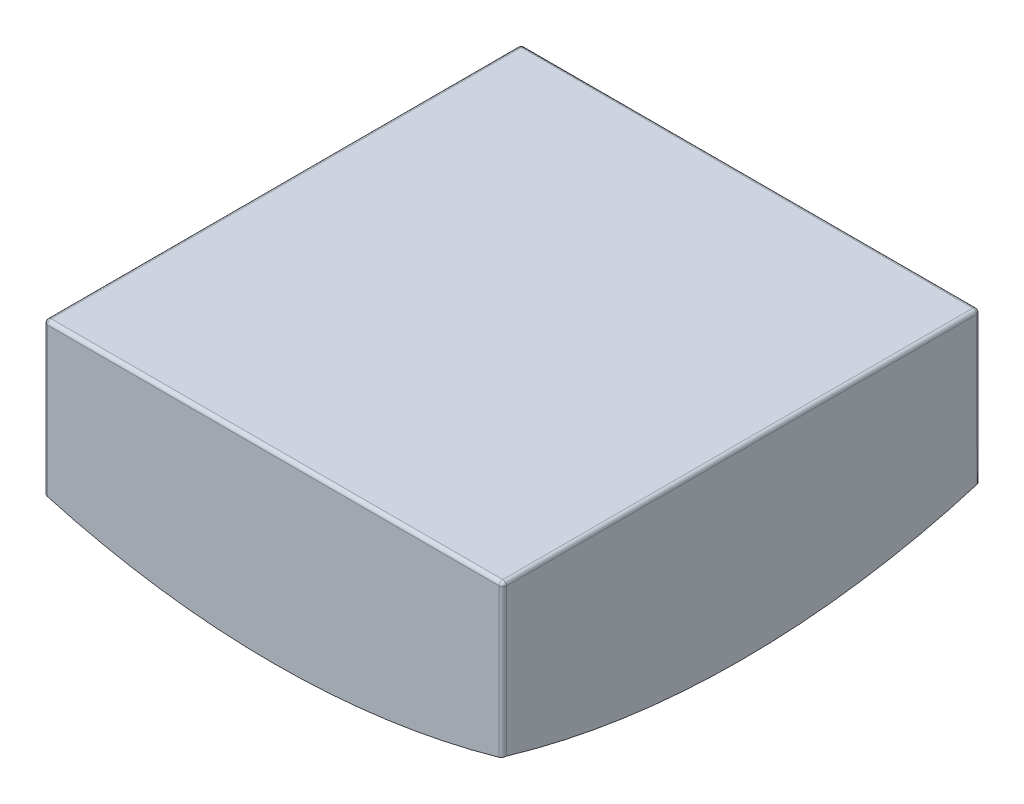
ISO-10303-21;
HEADER;
FILE_DESCRIPTION(('STEP AP214'),'2;1');
FILE_NAME('part.step','',(''),(''),'','','');
FILE_SCHEMA(('AUTOMOTIVE_DESIGN { 1 0 10303 214 1 1 1 1 }'));
ENDSEC;
DATA;
#1=APPLICATION_CONTEXT('core data for automotive mechanical design processes');
#2=APPLICATION_PROTOCOL_DEFINITION('international standard','automotive_design',2000,#1);
#3=PRODUCT_CONTEXT('',#1,'mechanical');
#4=PRODUCT('Part','Part','',(#3));
#5=PRODUCT_RELATED_PRODUCT_CATEGORY('part','',(#4));
#6=PRODUCT_DEFINITION_FORMATION('','',#4);
#7=PRODUCT_DEFINITION_CONTEXT('part definition',#1,'design');
#8=PRODUCT_DEFINITION('design','',#6,#7);
#9=PRODUCT_DEFINITION_SHAPE('','',#8);
#10=(LENGTH_UNIT() NAMED_UNIT(*) SI_UNIT(.MILLI.,.METRE.));
#11=(NAMED_UNIT(*) PLANE_ANGLE_UNIT() SI_UNIT($,.RADIAN.));
#12=(NAMED_UNIT(*) SI_UNIT($,.STERADIAN.) SOLID_ANGLE_UNIT());
#13=UNCERTAINTY_MEASURE_WITH_UNIT(LENGTH_MEASURE(1.E-05),#10,'distance_accuracy_value','');
#14=(GEOMETRIC_REPRESENTATION_CONTEXT(3) GLOBAL_UNCERTAINTY_ASSIGNED_CONTEXT((#13)) GLOBAL_UNIT_ASSIGNED_CONTEXT((#10,
#11,#12)) REPRESENTATION_CONTEXT('',''));
#15=CARTESIAN_POINT('',(0.,0.,0.));
#16=DIRECTION('',(0.,0.,1.));
#17=DIRECTION('',(1.,0.,0.));
#18=AXIS2_PLACEMENT_3D('',#15,#16,#17);
#19=CARTESIAN_POINT('',(0.615,0.,-0.64));
#20=DIRECTION('',(0.,0.,1.));
#21=DIRECTION('',(0.,-1.,0.));
#22=AXIS2_PLACEMENT_3D('',#19,#20,#21);
#23=CYLINDRICAL_SURFACE('',#22,0.01);
#24=DIRECTION('',(0.,0.,1.));
#25=VECTOR('',#24,1.);
#26=CARTESIAN_POINT('',(0.625,0.,-0.64));
#27=LINE('',#26,#25);
#28=CARTESIAN_POINT('',(0.625,0.,-0.64));
#29=VERTEX_POINT('',#28);
#30=CARTESIAN_POINT('',(0.625,0.,0.64));
#31=VERTEX_POINT('',#30);
#32=EDGE_CURVE('E312',#29,#31,#27,.T.);
#33=ORIENTED_EDGE('',*,*,#32,.F.);
#34=CARTESIAN_POINT('',(0.615,0.,-0.64));
#35=DIRECTION('',(0.,0.,1.));
#36=DIRECTION('',(0.,-1.,0.));
#37=AXIS2_PLACEMENT_3D('',#34,#35,#36);
#38=CIRCLE('',#37,0.01);
#39=CARTESIAN_POINT('',(0.615,0.01,-0.64));
#40=VERTEX_POINT('',#39);
#41=EDGE_CURVE('E320',#29,#40,#38,.T.);
#42=ORIENTED_EDGE('',*,*,#41,.T.);
#43=DIRECTION('',(0.,0.,1.));
#44=VECTOR('',#43,1.);
#45=CARTESIAN_POINT('',(0.615,0.01,-0.64));
#46=LINE('',#45,#44);
#47=CARTESIAN_POINT('',(0.615,0.01,0.64));
#48=VERTEX_POINT('',#47);
#49=EDGE_CURVE('E50',#40,#48,#46,.T.);
#50=ORIENTED_EDGE('',*,*,#49,.T.);
#51=CARTESIAN_POINT('',(0.615,0.,0.64));
#52=DIRECTION('',(0.,0.,1.));
#53=DIRECTION('',(0.,-1.,0.));
#54=AXIS2_PLACEMENT_3D('',#51,#52,#53);
#55=CIRCLE('',#54,0.01);
#56=EDGE_CURVE('E11',#31,#48,#55,.T.);
#57=ORIENTED_EDGE('',*,*,#56,.F.);
#58=EDGE_LOOP('',(#33,#42,#50,#57));
#59=FACE_BOUND('',#58,.T.);
#60=ADVANCED_FACE('F17',(#59),#23,.T.);
#61=CARTESIAN_POINT('',(0.615,0.,0.64));
#62=DIRECTION('',(0.,0.707106781186546,-0.707106781186549));
#63=DIRECTION('',(0.707106781186549,0.5,0.5));
#64=AXIS2_PLACEMENT_3D('',#61,#62,#63);
#65=SPHERICAL_SURFACE('',#64,0.01);
#66=CARTESIAN_POINT('',(0.615,0.,0.64));
#67=DIRECTION('',(0.,-1.,0.));
#68=DIRECTION('',(0.,0.,-1.));
#69=AXIS2_PLACEMENT_3D('',#66,#67,#68);
#70=CIRCLE('',#69,0.01);
#71=CARTESIAN_POINT('',(0.615,0.,0.65));
#72=VERTEX_POINT('',#71);
#73=EDGE_CURVE('E304',#31,#72,#70,.T.);
#74=ORIENTED_EDGE('',*,*,#73,.F.);
#75=ORIENTED_EDGE('',*,*,#56,.T.);
#76=CARTESIAN_POINT('',(0.615,0.,0.64));
#77=DIRECTION('',(-1.,0.,0.));
#78=DIRECTION('',(0.,-1.,0.));
#79=AXIS2_PLACEMENT_3D('',#76,#77,#78);
#80=CIRCLE('',#79,0.01);
#81=EDGE_CURVE('E29',#72,#48,#80,.T.);
#82=ORIENTED_EDGE('',*,*,#81,.F.);
#83=EDGE_LOOP('',(#74,#75,#82));
#84=FACE_BOUND('',#83,.T.);
#85=ADVANCED_FACE('F19',(#84),#65,.T.);
#86=CARTESIAN_POINT('',(0.615,0.,0.64));
#87=DIRECTION('',(-1.,0.,0.));
#88=DIRECTION('',(0.,-1.,0.));
#89=AXIS2_PLACEMENT_3D('',#86,#87,#88);
#90=CYLINDRICAL_SURFACE('',#89,0.01);
#91=DIRECTION('',(-1.,0.,0.));
#92=VECTOR('',#91,1.);
#93=CARTESIAN_POINT('',(0.615,0.,0.65));
#94=LINE('',#93,#92);
#95=CARTESIAN_POINT('',(-0.615,0.,0.65));
#96=VERTEX_POINT('',#95);
#97=EDGE_CURVE('E305',#72,#96,#94,.T.);
#98=ORIENTED_EDGE('',*,*,#97,.F.);
#99=ORIENTED_EDGE('',*,*,#81,.T.);
#100=DIRECTION('',(-1.,0.,0.));
#101=VECTOR('',#100,1.);
#102=CARTESIAN_POINT('',(0.615,0.01,0.64));
#103=LINE('',#102,#101);
#104=CARTESIAN_POINT('',(-0.615,0.01,0.64));
#105=VERTEX_POINT('',#104);
#106=EDGE_CURVE('E326',#48,#105,#103,.T.);
#107=ORIENTED_EDGE('',*,*,#106,.T.);
#108=CARTESIAN_POINT('',(-0.615,0.,0.64));
#109=DIRECTION('',(-1.,0.,0.));
#110=DIRECTION('',(0.,-1.,0.));
#111=AXIS2_PLACEMENT_3D('',#108,#109,#110);
#112=CIRCLE('',#111,0.01);
#113=EDGE_CURVE('E259',#96,#105,#112,.T.);
#114=ORIENTED_EDGE('',*,*,#113,.F.);
#115=EDGE_LOOP('',(#98,#99,#107,#114));
#116=FACE_BOUND('',#115,.T.);
#117=ADVANCED_FACE('F543',(#116),#90,.T.);
#118=CARTESIAN_POINT('',(-0.615,0.,0.64));
#119=DIRECTION('',(0.,-0.707106781186546,0.707106781186549));
#120=DIRECTION('',(-0.707106781186549,0.5,0.5));
#121=AXIS2_PLACEMENT_3D('',#118,#119,#120);
#122=SPHERICAL_SURFACE('',#121,0.01);
#123=CARTESIAN_POINT('',(-0.615,0.,0.64));
#124=DIRECTION('',(0.,1.,0.));
#125=DIRECTION('',(0.,0.,-1.));
#126=AXIS2_PLACEMENT_3D('',#123,#124,#125);
#127=CIRCLE('',#126,0.01);
#128=CARTESIAN_POINT('',(-0.625,0.,0.64));
#129=VERTEX_POINT('',#128);
#130=EDGE_CURVE('E296',#129,#96,#127,.T.);
#131=ORIENTED_EDGE('',*,*,#130,.T.);
#132=ORIENTED_EDGE('',*,*,#113,.T.);
#133=CARTESIAN_POINT('',(-0.615,0.,0.64));
#134=DIRECTION('',(0.,0.,-1.));
#135=DIRECTION('',(0.,-1.,0.));
#136=AXIS2_PLACEMENT_3D('',#133,#134,#135);
#137=CIRCLE('',#136,0.01);
#138=EDGE_CURVE('E221',#129,#105,#137,.T.);
#139=ORIENTED_EDGE('',*,*,#138,.F.);
#140=EDGE_LOOP('',(#131,#132,#139));
#141=FACE_BOUND('',#140,.T.);
#142=ADVANCED_FACE('F498',(#141),#122,.T.);
#143=CARTESIAN_POINT('',(0.,0.01,0.));
#144=DIRECTION('',(0.,1.,0.));
#145=DIRECTION('',(0.,0.,-1.));
#146=AXIS2_PLACEMENT_3D('',#143,#144,#145);
#147=PLANE('',#146);
#148=DIRECTION('',(0.,0.,-1.));
#149=VECTOR('',#148,1.);
#150=CARTESIAN_POINT('',(-0.615,0.01,0.64));
#151=LINE('',#150,#149);
#152=CARTESIAN_POINT('',(-0.615,0.01,-0.64));
#153=VERTEX_POINT('',#152);
#154=EDGE_CURVE('E225',#105,#153,#151,.T.);
#155=ORIENTED_EDGE('',*,*,#154,.F.);
#156=ORIENTED_EDGE('',*,*,#106,.F.);
#157=ORIENTED_EDGE('',*,*,#49,.F.);
#158=DIRECTION('',(1.,0.,0.));
#159=VECTOR('',#158,1.);
#160=CARTESIAN_POINT('',(-0.615,0.01,-0.64));
#161=LINE('',#160,#159);
#162=EDGE_CURVE('E325',#153,#40,#161,.T.);
#163=ORIENTED_EDGE('',*,*,#162,.F.);
#164=EDGE_LOOP('',(#155,#156,#157,#163));
#165=FACE_BOUND('',#164,.T.);
#166=ADVANCED_FACE('F547',(#165),#147,.T.);
#167=CARTESIAN_POINT('',(-0.615,0.,-0.64));
#168=DIRECTION('',(0.,0.707106781186546,0.707106781186549));
#169=DIRECTION('',(-0.70710678118655,0.5,-0.5));
#170=AXIS2_PLACEMENT_3D('',#167,#168,#169);
#171=SPHERICAL_SURFACE('',#170,0.01);
#172=CARTESIAN_POINT('',(-0.615,0.,-0.64));
#173=DIRECTION('',(0.,-1.,0.));
#174=DIRECTION('',(0.,0.,1.));
#175=AXIS2_PLACEMENT_3D('',#172,#173,#174);
#176=CIRCLE('',#175,0.01);
#177=CARTESIAN_POINT('',(-0.625,0.,-0.64));
#178=VERTEX_POINT('',#177);
#179=CARTESIAN_POINT('',(-0.615,0.,-0.65));
#180=VERTEX_POINT('',#179);
#181=EDGE_CURVE('E226',#178,#180,#176,.T.);
#182=ORIENTED_EDGE('',*,*,#181,.F.);
#183=CARTESIAN_POINT('',(-0.615,0.,-0.64));
#184=DIRECTION('',(0.,0.,-1.));
#185=DIRECTION('',(0.,-1.,0.));
#186=AXIS2_PLACEMENT_3D('',#183,#184,#185);
#187=CIRCLE('',#186,0.01);
#188=EDGE_CURVE('E292',#178,#153,#187,.T.);
#189=ORIENTED_EDGE('',*,*,#188,.T.);
#190=CARTESIAN_POINT('',(-0.615,0.,-0.64));
#191=DIRECTION('',(1.,0.,0.));
#192=DIRECTION('',(0.,-1.,0.));
#193=AXIS2_PLACEMENT_3D('',#190,#191,#192);
#194=CIRCLE('',#193,0.01);
#195=EDGE_CURVE('E321',#180,#153,#194,.T.);
#196=ORIENTED_EDGE('',*,*,#195,.F.);
#197=EDGE_LOOP('',(#182,#189,#196));
#198=FACE_BOUND('',#197,.T.);
#199=ADVANCED_FACE('F507',(#198),#171,.T.);
#200=CARTESIAN_POINT('',(-0.615,0.,-0.64));
#201=DIRECTION('',(1.,0.,0.));
#202=DIRECTION('',(0.,-1.,0.));
#203=AXIS2_PLACEMENT_3D('',#200,#201,#202);
#204=CYLINDRICAL_SURFACE('',#203,0.01);
#205=DIRECTION('',(1.,0.,0.));
#206=VECTOR('',#205,1.);
#207=CARTESIAN_POINT('',(-0.615,0.,-0.65));
#208=LINE('',#207,#206);
#209=CARTESIAN_POINT('',(0.615,0.,-0.65));
#210=VERTEX_POINT('',#209);
#211=EDGE_CURVE('E284',#180,#210,#208,.T.);
#212=ORIENTED_EDGE('',*,*,#211,.F.);
#213=ORIENTED_EDGE('',*,*,#195,.T.);
#214=ORIENTED_EDGE('',*,*,#162,.T.);
#215=CARTESIAN_POINT('',(0.615,0.,-0.64));
#216=DIRECTION('',(1.,0.,0.));
#217=DIRECTION('',(0.,-1.,0.));
#218=AXIS2_PLACEMENT_3D('',#215,#216,#217);
#219=CIRCLE('',#218,0.01);
#220=EDGE_CURVE('E316',#210,#40,#219,.T.);
#221=ORIENTED_EDGE('',*,*,#220,.F.);
#222=EDGE_LOOP('',(#212,#213,#214,#221));
#223=FACE_BOUND('',#222,.T.);
#224=ADVANCED_FACE('F555',(#223),#204,.T.);
#225=CARTESIAN_POINT('',(0.615,0.,-0.64));
#226=DIRECTION('',(-0.707106781186549,0.707106781186546,0.));
#227=DIRECTION('',(0.5,0.5,-0.70710678118655));
#228=AXIS2_PLACEMENT_3D('',#225,#226,#227);
#229=SPHERICAL_SURFACE('',#228,0.01);
#230=CARTESIAN_POINT('',(0.615,0.,-0.64));
#231=DIRECTION('',(0.,-1.,0.));
#232=DIRECTION('',(-1.,0.,0.));
#233=AXIS2_PLACEMENT_3D('',#230,#231,#232);
#234=CIRCLE('',#233,0.01);
#235=EDGE_CURVE('E336',#210,#29,#234,.T.);
#236=ORIENTED_EDGE('',*,*,#235,.F.);
#237=ORIENTED_EDGE('',*,*,#220,.T.);
#238=ORIENTED_EDGE('',*,*,#41,.F.);
#239=EDGE_LOOP('',(#236,#237,#238));
#240=FACE_BOUND('',#239,.T.);
#241=ADVANCED_FACE('F572',(#240),#229,.T.);
#242=CARTESIAN_POINT('',(0.625,0.,-0.64));
#243=DIRECTION('',(-1.,0.,0.));
#244=DIRECTION('',(0.,0.,1.));
#245=AXIS2_PLACEMENT_3D('',#242,#243,#244);
#246=PLANE('',#245);
#247=DIRECTION('',(0.,-1.,0.));
#248=VECTOR('',#247,1.);
#249=CARTESIAN_POINT('',(0.625,0.,0.64));
#250=LINE('',#249,#248);
#251=CARTESIAN_POINT('',(0.625000000252148,-0.401452054135224,0.640000059304314));
#252=VERTEX_POINT('',#251);
#253=EDGE_CURVE('E309',#31,#252,#250,.T.);
#254=ORIENTED_EDGE('',*,*,#253,.T.);
#255=CARTESIAN_POINT('',(0.625,1.755617146395,-0.001000000000004));
#256=DIRECTION('',(1.,0.,0.));
#257=DIRECTION('',(0.,1.,0.));
#258=AXIS2_PLACEMENT_3D('',#255,#256,#257);
#259=CIRCLE('',#258,2.250295214748);
#260=CARTESIAN_POINT('',(0.6248989794855,-0.401521187804178,-0.641));
#261=VERTEX_POINT('',#260);
#262=EDGE_CURVE('E343',#252,#261,#259,.T.);
#263=ORIENTED_EDGE('',*,*,#262,.T.);
#264=DIRECTION('',(0.,-1.,0.));
#265=VECTOR('',#264,1.);
#266=CARTESIAN_POINT('',(0.625,0.,-0.64));
#267=LINE('',#266,#265);
#268=EDGE_CURVE('E285',#29,#261,#267,.T.);
#269=ORIENTED_EDGE('',*,*,#268,.F.);
#270=ORIENTED_EDGE('',*,*,#32,.T.);
#271=EDGE_LOOP('',(#254,#263,#269,#270));
#272=FACE_BOUND('',#271,.T.);
#273=ADVANCED_FACE('F524',(#272),#246,.F.);
#274=CARTESIAN_POINT('',(0.615,0.,0.64));
#275=DIRECTION('',(0.,-1.,0.));
#276=DIRECTION('',(0.,0.,-1.));
#277=AXIS2_PLACEMENT_3D('',#274,#275,#276);
#278=CYLINDRICAL_SURFACE('',#277,0.01);
#279=ORIENTED_EDGE('',*,*,#73,.T.);
#280=DIRECTION('',(0.,-1.,0.));
#281=VECTOR('',#280,1.);
#282=CARTESIAN_POINT('',(0.615,0.,0.65));
#283=LINE('',#282,#281);
#284=CARTESIAN_POINT('',(0.615,-0.404318599467,0.65));
#285=VERTEX_POINT('',#284);
#286=EDGE_CURVE('E301',#72,#285,#283,.T.);
#287=ORIENTED_EDGE('',*,*,#286,.T.);
#288=CARTESIAN_POINT('',(0.624999999997,-0.401452058225,0.640000241365));
#289=CARTESIAN_POINT('',(0.624999936924,-0.401452076463,0.642613415617));
#290=CARTESIAN_POINT('',(0.62418052763,-0.401688978374,0.645244903499));
#291=CARTESIAN_POINT('',(0.622520283201,-0.402169235486,0.647534348745));
#292=CARTESIAN_POINT('',(0.62024077937,-0.402825310002,0.649171941443));
#293=CARTESIAN_POINT('',(0.61762531282,-0.40357260607,0.65));
#294=CARTESIAN_POINT('',(0.615,-0.404318599467,0.65));
#295=(BOUNDED_CURVE() B_SPLINE_CURVE(6,(#288,#289,#290,#291,#292,#293,#294),.UNSPECIFIED.,.F.,
.F.) B_SPLINE_CURVE_WITH_KNOTS((7,7),(0.,1.),
.UNSPECIFIED.) CURVE() GEOMETRIC_REPRESENTATION_ITEM() RATIONAL_B_SPLINE_CURVE((1.,1.,1.,1.,1.,
1.,1.)) REPRESENTATION_ITEM(''));
#296=EDGE_CURVE('E275',#252,#285,#295,.T.);
#297=ORIENTED_EDGE('',*,*,#296,.F.);
#298=ORIENTED_EDGE('',*,*,#253,.F.);
#299=EDGE_LOOP('',(#279,#287,#297,#298));
#300=FACE_BOUND('',#299,.T.);
#301=ADVANCED_FACE('F483',(#300),#278,.T.);
#302=CARTESIAN_POINT('',(0.615,0.,0.65));
#303=DIRECTION('',(0.,0.,-1.));
#304=DIRECTION('',(0.,-1.,0.));
#305=AXIS2_PLACEMENT_3D('',#302,#303,#304);
#306=PLANE('',#305);
#307=ORIENTED_EDGE('',*,*,#97,.T.);
#308=DIRECTION('',(0.,-1.,0.));
#309=VECTOR('',#308,1.);
#310=CARTESIAN_POINT('',(-0.615,0.,0.65));
#311=LINE('',#310,#309);
#312=CARTESIAN_POINT('',(-0.615,-0.404318599467,0.65));
#313=VERTEX_POINT('',#312);
#314=EDGE_CURVE('E300',#96,#313,#311,.T.);
#315=ORIENTED_EDGE('',*,*,#314,.T.);
#316=CARTESIAN_POINT('',(0.,1.76,0.65));
#317=DIRECTION('',(0.,0.,1.));
#318=DIRECTION('',(1.,0.,0.));
#319=AXIS2_PLACEMENT_3D('',#316,#317,#318);
#320=CIRCLE('',#319,2.25);
#321=EDGE_CURVE('E276',#313,#285,#320,.T.);
#322=ORIENTED_EDGE('',*,*,#321,.T.);
#323=ORIENTED_EDGE('',*,*,#286,.F.);
#324=EDGE_LOOP('',(#307,#315,#322,#323));
#325=FACE_BOUND('',#324,.T.);
#326=ADVANCED_FACE('F487',(#325),#306,.F.);
#327=CARTESIAN_POINT('',(-0.615,0.,0.64));
#328=DIRECTION('',(0.,-1.,0.));
#329=DIRECTION('',(0.,0.,-1.));
#330=AXIS2_PLACEMENT_3D('',#327,#328,#329);
#331=CYLINDRICAL_SURFACE('',#330,0.01);
#332=ORIENTED_EDGE('',*,*,#130,.F.);
#333=DIRECTION('',(0.,-1.,0.));
#334=VECTOR('',#333,1.);
#335=CARTESIAN_POINT('',(-0.625,0.,0.64));
#336=LINE('',#335,#334);
#337=CARTESIAN_POINT('',(-0.625000000251901,-0.401452054139244,0.64000005932617));
#338=VERTEX_POINT('',#337);
#339=EDGE_CURVE('E262',#129,#338,#336,.T.);
#340=ORIENTED_EDGE('',*,*,#339,.T.);
#341=CARTESIAN_POINT('',(-0.624999999997,-0.401452058225,0.640000241443));
#342=CARTESIAN_POINT('',(-0.624999924232,-0.401452080133,0.643138237658));
#343=CARTESIAN_POINT('',(-0.623769633399,-0.401807803196,0.646298066094));
#344=CARTESIAN_POINT('',(-0.621277564424,-0.402528692925,0.648762716071));
#345=CARTESIAN_POINT('',(-0.618153197724,-0.403422605411,0.65));
#346=CARTESIAN_POINT('',(-0.615,-0.404318599467,0.65));
#347=(BOUNDED_CURVE() B_SPLINE_CURVE(5,(#341,#342,#343,#344,#345,#346),.UNSPECIFIED.,.F.,
.F.) B_SPLINE_CURVE_WITH_KNOTS((6,6),(0.,1.),
.UNSPECIFIED.) CURVE() GEOMETRIC_REPRESENTATION_ITEM() RATIONAL_B_SPLINE_CURVE((1.,1.,1.,1.,1.,1.)) REPRESENTATION_ITEM(''));
#348=EDGE_CURVE('E189',#338,#313,#347,.T.);
#349=ORIENTED_EDGE('',*,*,#348,.T.);
#350=ORIENTED_EDGE('',*,*,#314,.F.);
#351=EDGE_LOOP('',(#332,#340,#349,#350));
#352=FACE_BOUND('',#351,.T.);
#353=ADVANCED_FACE('F495',(#352),#331,.T.);
#354=CARTESIAN_POINT('',(-0.615,0.,0.64));
#355=DIRECTION('',(0.,0.,-1.));
#356=DIRECTION('',(0.,-1.,0.));
#357=AXIS2_PLACEMENT_3D('',#354,#355,#356);
#358=CYLINDRICAL_SURFACE('',#357,0.01);
#359=DIRECTION('',(0.,0.,-1.));
#360=VECTOR('',#359,1.);
#361=CARTESIAN_POINT('',(-0.625,0.,0.64));
#362=LINE('',#361,#360);
#363=EDGE_CURVE('E195',#129,#178,#362,.T.);
#364=ORIENTED_EDGE('',*,*,#363,.F.);
#365=ORIENTED_EDGE('',*,*,#138,.T.);
#366=ORIENTED_EDGE('',*,*,#154,.T.);
#367=ORIENTED_EDGE('',*,*,#188,.F.);
#368=EDGE_LOOP('',(#364,#365,#366,#367));
#369=FACE_BOUND('',#368,.T.);
#370=ADVANCED_FACE('F502',(#369),#358,.T.);
#371=CARTESIAN_POINT('',(-0.615,0.,-0.64));
#372=DIRECTION('',(0.,-1.,0.));
#373=DIRECTION('',(0.,0.,1.));
#374=AXIS2_PLACEMENT_3D('',#371,#372,#373);
#375=CYLINDRICAL_SURFACE('',#374,0.01);
#376=ORIENTED_EDGE('',*,*,#181,.T.);
#377=DIRECTION('',(0.,-1.,0.));
#378=VECTOR('',#377,1.);
#379=CARTESIAN_POINT('',(-0.615,0.,-0.65));
#380=LINE('',#379,#378);
#381=CARTESIAN_POINT('',(-0.615,-0.404318599467,-0.65));
#382=VERTEX_POINT('',#381);
#383=EDGE_CURVE('E281',#180,#382,#380,.T.);
#384=ORIENTED_EDGE('',*,*,#383,.T.);
#385=CARTESIAN_POINT('',(-0.625000000003,-0.401452058222,-0.64));
#386=CARTESIAN_POINT('',(-0.625000000003,-0.401452058222,-0.642613352086));
#387=CARTESIAN_POINT('',(-0.624179902611,-0.401689161535,-0.645245632972));
#388=CARTESIAN_POINT('',(-0.622521815894,-0.402168791035,-0.647532911508));
#389=CARTESIAN_POINT('',(-0.620239987963,-0.402825537234,-0.649172213088));
#390=CARTESIAN_POINT('',(-0.617626062755,-0.403572392973,-0.65));
#391=CARTESIAN_POINT('',(-0.615,-0.404318599467,-0.65));
#392=(BOUNDED_CURVE() B_SPLINE_CURVE(6,(#385,#386,#387,#388,#389,#390,#391),.UNSPECIFIED.,.F.,
.F.) B_SPLINE_CURVE_WITH_KNOTS((7,7),(0.,1.),
.UNSPECIFIED.) CURVE() GEOMETRIC_REPRESENTATION_ITEM() RATIONAL_B_SPLINE_CURVE((1.,1.,1.,1.,1.,
1.,1.)) REPRESENTATION_ITEM(''));
#393=CARTESIAN_POINT('',(-0.625,-0.401452058225,-0.64));
#394=VERTEX_POINT('',#393);
#395=EDGE_CURVE('E231',#394,#382,#392,.T.);
#396=ORIENTED_EDGE('',*,*,#395,.F.);
#397=DIRECTION('',(0.,-1.,0.));
#398=VECTOR('',#397,1.);
#399=CARTESIAN_POINT('',(-0.625,0.,-0.64));
#400=LINE('',#399,#398);
#401=EDGE_CURVE('E256',#178,#394,#400,.T.);
#402=ORIENTED_EDGE('',*,*,#401,.F.);
#403=EDGE_LOOP('',(#376,#384,#396,#402));
#404=FACE_BOUND('',#403,.T.);
#405=ADVANCED_FACE('F511',(#404),#375,.T.);
#406=CARTESIAN_POINT('',(-0.615,0.,-0.65));
#407=DIRECTION('',(0.,0.,1.));
#408=DIRECTION('',(1.,0.,0.));
#409=AXIS2_PLACEMENT_3D('',#406,#407,#408);
#410=PLANE('',#409);
#411=DIRECTION('',(0.,-1.,0.));
#412=VECTOR('',#411,1.);
#413=CARTESIAN_POINT('',(0.615,0.,-0.65));
#414=LINE('',#413,#412);
#415=CARTESIAN_POINT('',(0.615,-0.404318599467,-0.65));
#416=VERTEX_POINT('',#415);
#417=EDGE_CURVE('E342',#210,#416,#414,.T.);
#418=ORIENTED_EDGE('',*,*,#417,.T.);
#419=CARTESIAN_POINT('',(0.,1.76,-0.65));
#420=DIRECTION('',(0.,0.,-1.));
#421=DIRECTION('',(1.,0.,0.));
#422=AXIS2_PLACEMENT_3D('',#419,#420,#421);
#423=CIRCLE('',#422,2.25);
#424=EDGE_CURVE('E196',#416,#382,#423,.T.);
#425=ORIENTED_EDGE('',*,*,#424,.T.);
#426=ORIENTED_EDGE('',*,*,#383,.F.);
#427=ORIENTED_EDGE('',*,*,#211,.T.);
#428=EDGE_LOOP('',(#418,#425,#426,#427));
#429=FACE_BOUND('',#428,.T.);
#430=ADVANCED_FACE('F534',(#429),#410,.F.);
#431=CARTESIAN_POINT('',(0.615,0.,-0.64));
#432=DIRECTION('',(0.,-1.,0.));
#433=DIRECTION('',(-1.,0.,0.));
#434=AXIS2_PLACEMENT_3D('',#431,#432,#433);
#435=CYLINDRICAL_SURFACE('',#434,0.01);
#436=ORIENTED_EDGE('',*,*,#417,.F.);
#437=ORIENTED_EDGE('',*,*,#235,.T.);
#438=ORIENTED_EDGE('',*,*,#268,.T.);
#439=CARTESIAN_POINT('',(0.615,-0.404318599467,-0.65));
#440=CARTESIAN_POINT('',(0.617412774925792,-0.403632999583983,-0.65));
#441=CARTESIAN_POINT('',(0.6198172256451,-0.40294630158954,-0.649300588960072));
#442=CARTESIAN_POINT('',(0.621960215534367,-0.402330324241615,-0.64791615393482));
#443=CARTESIAN_POINT('',(0.623619137330209,-0.40185123534459,-0.645960337614426));
#444=CARTESIAN_POINT('',(0.624614326477385,-0.401563560163105,-0.643654587326144));
#445=CARTESIAN_POINT('',(0.624919341555062,-0.40147537806618,-0.641267598841923));
#446=(BOUNDED_CURVE() B_SPLINE_CURVE(6,(#439,#440,#441,#442,#443,#444,#445),.UNSPECIFIED.,.F.,
.F.) B_SPLINE_CURVE_WITH_KNOTS((7,7),(0.,0.919046881112213),
.UNSPECIFIED.) CURVE() GEOMETRIC_REPRESENTATION_ITEM() RATIONAL_B_SPLINE_CURVE((1.,1.,1.,1.,1.,
1.,1.)) REPRESENTATION_ITEM(''));
#447=EDGE_CURVE('E353',#416,#261,#446,.T.);
#448=ORIENTED_EDGE('',*,*,#447,.F.);
#449=EDGE_LOOP('',(#436,#437,#438,#448));
#450=FACE_BOUND('',#449,.T.);
#451=ADVANCED_FACE('F516',(#450),#435,.T.);
#452=CARTESIAN_POINT('',(0.625,-0.401452058225,-0.642));
#453=DIRECTION('',(0.,0.,1.));
#454=DIRECTION('',(1.,0.,0.));
#455=AXIS2_PLACEMENT_3D('',#452,#453,#454);
#456=PLANE('',#455);
#457=DIRECTION('',(-1.,0.,0.));
#458=VECTOR('',#457,1.);
#459=CARTESIAN_POINT('',(0.625,-0.401452058225,-0.642));
#460=LINE('',#459,#458);
#461=CARTESIAN_POINT('',(0.615,-0.401452058225,-0.642));
#462=VERTEX_POINT('',#461);
#463=EDGE_CURVE('E339',#261,#462,#460,.T.);
#464=ORIENTED_EDGE('',*,*,#463,.T.);
#465=DIRECTION('',(0.,-1.,0.));
#466=VECTOR('',#465,1.);
#467=CARTESIAN_POINT('',(0.615,-0.401452058225,-0.642));
#468=LINE('',#467,#466);
#469=CARTESIAN_POINT('',(0.615,-0.404318599467,-0.642));
#470=VERTEX_POINT('',#469);
#471=EDGE_CURVE('E241',#462,#470,#468,.T.);
#472=ORIENTED_EDGE('',*,*,#471,.T.);
#473=CARTESIAN_POINT('',(0.,1.76,-0.642));
#474=DIRECTION('',(0.,0.,-1.));
#475=DIRECTION('',(1.,0.,0.));
#476=AXIS2_PLACEMENT_3D('',#473,#474,#475);
#477=CIRCLE('',#476,2.25);
#478=EDGE_CURVE('E232',#261,#470,#477,.T.);
#479=ORIENTED_EDGE('',*,*,#478,.F.);
#480=EDGE_LOOP('',(#464,#472,#479));
#481=FACE_BOUND('',#480,.T.);
#482=ADVANCED_FACE('F525',(#481),#456,.T.);
#483=CARTESIAN_POINT('',(0.625,1.755617146395,-0.001000000000004));
#484=DIRECTION('',(1.,0.,0.));
#485=DIRECTION('',(0.,-1.,1.28899576682455E-08));
#486=AXIS2_PLACEMENT_3D('',#483,#484,#485);
#487=CYLINDRICAL_SURFACE('',#486,2.250295214748);
#488=ORIENTED_EDGE('',*,*,#262,.F.);
#489=DIRECTION('',(-1.,0.,0.));
#490=VECTOR('',#489,1.);
#491=CARTESIAN_POINT('',(0.625,-0.401452058225,0.64));
#492=LINE('',#491,#490);
#493=CARTESIAN_POINT('',(0.615,-0.401452058225,0.64));
#494=VERTEX_POINT('',#493);
#495=EDGE_CURVE('E280',#252,#494,#492,.T.);
#496=ORIENTED_EDGE('',*,*,#495,.T.);
#497=CARTESIAN_POINT('',(0.615,1.755617146395,-0.001000000000004));
#498=DIRECTION('',(1.,0.,0.));
#499=DIRECTION('',(0.,1.,0.));
#500=AXIS2_PLACEMENT_3D('',#497,#498,#499);
#501=CIRCLE('',#500,2.250295214748);
#502=CARTESIAN_POINT('',(0.615,-0.402045374371,-0.64));
#503=VERTEX_POINT('',#502);
#504=EDGE_CURVE('E206',#494,#503,#501,.T.);
#505=ORIENTED_EDGE('',*,*,#504,.T.);
#506=CARTESIAN_POINT('',(0.615,1.755617146395,-0.001000000000004));
#507=DIRECTION('',(1.,0.,0.));
#508=DIRECTION('',(0.,1.,0.));
#509=AXIS2_PLACEMENT_3D('',#506,#507,#508);
#510=CIRCLE('',#509,2.250295214748);
#511=EDGE_CURVE('E236',#503,#462,#510,.T.);
#512=ORIENTED_EDGE('',*,*,#511,.T.);
#513=ORIENTED_EDGE('',*,*,#463,.F.);
#514=EDGE_LOOP('',(#488,#496,#505,#512,#513));
#515=FACE_BOUND('',#514,.T.);
#516=ADVANCED_FACE('F523',(#515),#487,.T.);
#517=CARTESIAN_POINT('',(0.625,-0.401452058225,0.64));
#518=DIRECTION('',(0.,0.,1.));
#519=DIRECTION('',(0.,-1.,0.));
#520=AXIS2_PLACEMENT_3D('',#517,#518,#519);
#521=PLANE('',#520);
#522=CARTESIAN_POINT('',(0.,1.76,0.64));
#523=DIRECTION('',(0.,0.,1.));
#524=DIRECTION('',(1.,0.,0.));
#525=AXIS2_PLACEMENT_3D('',#522,#523,#524);
#526=CIRCLE('',#525,2.25);
#527=CARTESIAN_POINT('',(0.615,-0.404318599467,0.64));
#528=VERTEX_POINT('',#527);
#529=EDGE_CURVE('E269',#528,#252,#526,.T.);
#530=ORIENTED_EDGE('',*,*,#529,.F.);
#531=DIRECTION('',(0.,-1.,0.));
#532=VECTOR('',#531,1.);
#533=CARTESIAN_POINT('',(0.615,0.,0.64));
#534=LINE('',#533,#532);
#535=EDGE_CURVE('E212',#494,#528,#534,.T.);
#536=ORIENTED_EDGE('',*,*,#535,.F.);
#537=ORIENTED_EDGE('',*,*,#495,.F.);
#538=EDGE_LOOP('',(#530,#536,#537));
#539=FACE_BOUND('',#538,.T.);
#540=ADVANCED_FACE('F479',(#539),#521,.F.);
#541=CARTESIAN_POINT('',(0.,1.76,0.65));
#542=DIRECTION('',(0.,0.,1.));
#543=DIRECTION('',(1.,0.,0.));
#544=AXIS2_PLACEMENT_3D('',#541,#542,#543);
#545=CYLINDRICAL_SURFACE('',#544,2.25);
#546=ORIENTED_EDGE('',*,*,#348,.F.);
#547=CARTESIAN_POINT('',(0.,1.76,0.64));
#548=DIRECTION('',(0.,0.,1.));
#549=DIRECTION('',(1.,0.,0.));
#550=AXIS2_PLACEMENT_3D('',#547,#548,#549);
#551=CIRCLE('',#550,2.25);
#552=CARTESIAN_POINT('',(-0.615,-0.404318599467,0.64));
#553=VERTEX_POINT('',#552);
#554=EDGE_CURVE('E180',#338,#553,#551,.T.);
#555=ORIENTED_EDGE('',*,*,#554,.T.);
#556=CARTESIAN_POINT('',(0.,1.76,0.64));
#557=DIRECTION('',(0.,0.,1.));
#558=DIRECTION('',(1.,0.,0.));
#559=AXIS2_PLACEMENT_3D('',#556,#557,#558);
#560=CIRCLE('',#559,2.25);
#561=EDGE_CURVE('E185',#553,#528,#560,.T.);
#562=ORIENTED_EDGE('',*,*,#561,.T.);
#563=ORIENTED_EDGE('',*,*,#529,.T.);
#564=ORIENTED_EDGE('',*,*,#296,.T.);
#565=ORIENTED_EDGE('',*,*,#321,.F.);
#566=EDGE_LOOP('',(#546,#555,#562,#563,#564,#565));
#567=FACE_BOUND('',#566,.T.);
#568=ADVANCED_FACE('F182',(#567),#545,.T.);
#569=CARTESIAN_POINT('',(-0.625,0.,0.64));
#570=DIRECTION('',(1.,0.,0.));
#571=DIRECTION('',(0.,1.,0.));
#572=AXIS2_PLACEMENT_3D('',#569,#570,#571);
#573=PLANE('',#572);
#574=ORIENTED_EDGE('',*,*,#363,.T.);
#575=ORIENTED_EDGE('',*,*,#401,.T.);
#576=CARTESIAN_POINT('',(-0.625,1.755606123652,0.));
#577=DIRECTION('',(-1.,0.,0.));
#578=DIRECTION('',(0.,-1.,0.));
#579=AXIS2_PLACEMENT_3D('',#576,#577,#578);
#580=CIRCLE('',#579,2.25);
#581=EDGE_CURVE('E382',#394,#338,#580,.T.);
#582=ORIENTED_EDGE('',*,*,#581,.T.);
#583=ORIENTED_EDGE('',*,*,#339,.F.);
#584=EDGE_LOOP('',(#574,#575,#582,#583));
#585=FACE_BOUND('',#584,.T.);
#586=ADVANCED_FACE('F501',(#585),#573,.F.);
#587=CARTESIAN_POINT('',(-0.625,-0.401452058225,0.64));
#588=DIRECTION('',(0.,0.,-1.));
#589=DIRECTION('',(0.,-1.,0.));
#590=AXIS2_PLACEMENT_3D('',#587,#588,#589);
#591=PLANE('',#590);
#592=ORIENTED_EDGE('',*,*,#554,.F.);
#593=DIRECTION('',(1.,0.,0.));
#594=VECTOR('',#593,1.);
#595=CARTESIAN_POINT('',(-0.625,-0.401452058225,0.64));
#596=LINE('',#595,#594);
#597=CARTESIAN_POINT('',(-0.615,-0.401452058225,0.64));
#598=VERTEX_POINT('',#597);
#599=EDGE_CURVE('E201',#338,#598,#596,.T.);
#600=ORIENTED_EDGE('',*,*,#599,.T.);
#601=DIRECTION('',(0.,-1.,0.));
#602=VECTOR('',#601,1.);
#603=CARTESIAN_POINT('',(-0.615,0.,0.64));
#604=LINE('',#603,#602);
#605=EDGE_CURVE('E198',#598,#553,#604,.T.);
#606=ORIENTED_EDGE('',*,*,#605,.T.);
#607=EDGE_LOOP('',(#592,#600,#606));
#608=FACE_BOUND('',#607,.T.);
#609=ADVANCED_FACE('F199',(#608),#591,.T.);
#610=CARTESIAN_POINT('',(-0.625,-0.5,-0.64));
#611=DIRECTION('',(0.,0.,1.));
#612=DIRECTION('',(1.,0.,0.));
#613=AXIS2_PLACEMENT_3D('',#610,#611,#612);
#614=PLANE('',#613);
#615=DIRECTION('',(1.,0.,0.));
#616=VECTOR('',#615,1.);
#617=CARTESIAN_POINT('',(-0.625,-0.401452058225,-0.64));
#618=LINE('',#617,#616);
#619=CARTESIAN_POINT('',(-0.615,-0.401452058225,-0.64));
#620=VERTEX_POINT('',#619);
#621=EDGE_CURVE('E380',#394,#620,#618,.T.);
#622=ORIENTED_EDGE('',*,*,#621,.F.);
#623=CARTESIAN_POINT('',(0.,1.76,-0.64));
#624=DIRECTION('',(0.,0.,-1.));
#625=DIRECTION('',(1.,0.,0.));
#626=AXIS2_PLACEMENT_3D('',#623,#624,#625);
#627=CIRCLE('',#626,2.25);
#628=CARTESIAN_POINT('',(-0.615,-0.404318599467,-0.64));
#629=VERTEX_POINT('',#628);
#630=EDGE_CURVE('E227',#629,#394,#627,.T.);
#631=ORIENTED_EDGE('',*,*,#630,.F.);
#632=DIRECTION('',(0.,-1.,0.));
#633=VECTOR('',#632,1.);
#634=CARTESIAN_POINT('',(-0.615,0.,-0.64));
#635=LINE('',#634,#633);
#636=EDGE_CURVE('E432',#620,#629,#635,.T.);
#637=ORIENTED_EDGE('',*,*,#636,.F.);
#638=EDGE_LOOP('',(#622,#631,#637));
#639=FACE_BOUND('',#638,.T.);
#640=ADVANCED_FACE('F464',(#639),#614,.T.);
#641=CARTESIAN_POINT('',(0.,1.76,-0.65));
#642=DIRECTION('',(0.,0.,-1.));
#643=DIRECTION('',(1.,0.,0.));
#644=AXIS2_PLACEMENT_3D('',#641,#642,#643);
#645=CYLINDRICAL_SURFACE('',#644,2.25);
#646=ORIENTED_EDGE('',*,*,#447,.T.);
#647=ORIENTED_EDGE('',*,*,#478,.T.);
#648=DIRECTION('',(0.,0.,-1.));
#649=VECTOR('',#648,1.);
#650=CARTESIAN_POINT('',(0.615,-0.404318599467,-0.65));
#651=LINE('',#650,#649);
#652=CARTESIAN_POINT('',(0.615,-0.404318599467,-0.64));
#653=VERTEX_POINT('',#652);
#654=EDGE_CURVE('E237',#653,#470,#651,.T.);
#655=ORIENTED_EDGE('',*,*,#654,.F.);
#656=CARTESIAN_POINT('',(0.,1.76,-0.64));
#657=DIRECTION('',(0.,0.,-1.));
#658=DIRECTION('',(1.,0.,0.));
#659=AXIS2_PLACEMENT_3D('',#656,#657,#658);
#660=CIRCLE('',#659,2.25);
#661=EDGE_CURVE('E377',#653,#629,#660,.T.);
#662=ORIENTED_EDGE('',*,*,#661,.T.);
#663=ORIENTED_EDGE('',*,*,#630,.T.);
#664=ORIENTED_EDGE('',*,*,#395,.T.);
#665=ORIENTED_EDGE('',*,*,#424,.F.);
#666=EDGE_LOOP('',(#646,#647,#655,#662,#663,#664,#665));
#667=FACE_BOUND('',#666,.T.);
#668=ADVANCED_FACE('F455',(#667),#645,.T.);
#669=CARTESIAN_POINT('',(0.615,-0.476243395671,-0.0009999999999901));
#670=DIRECTION('',(1.,0.,0.));
#671=DIRECTION('',(0.,1.,0.));
#672=AXIS2_PLACEMENT_3D('',#669,#670,#671);
#673=PLANE('',#672);
#674=ORIENTED_EDGE('',*,*,#511,.F.);
#675=DIRECTION('',(0.,-1.,0.));
#676=VECTOR('',#675,1.);
#677=CARTESIAN_POINT('',(0.615,0.,-0.64));
#678=LINE('',#677,#676);
#679=EDGE_CURVE('E373',#503,#653,#678,.T.);
#680=ORIENTED_EDGE('',*,*,#679,.T.);
#681=ORIENTED_EDGE('',*,*,#654,.T.);
#682=ORIENTED_EDGE('',*,*,#471,.F.);
#683=EDGE_LOOP('',(#674,#680,#681,#682));
#684=FACE_BOUND('',#683,.T.);
#685=ADVANCED_FACE('F685',(#684),#673,.T.);
#686=CARTESIAN_POINT('',(0.615,0.,-0.64));
#687=DIRECTION('',(-1.,0.,0.));
#688=DIRECTION('',(0.,0.,1.));
#689=AXIS2_PLACEMENT_3D('',#686,#687,#688);
#690=PLANE('',#689);
#691=DIRECTION('',(0.,0.,1.));
#692=VECTOR('',#691,1.);
#693=CARTESIAN_POINT('',(0.615,0.,-0.64));
#694=LINE('',#693,#692);
#695=CARTESIAN_POINT('',(0.615,0.,-0.64));
#696=VERTEX_POINT('',#695);
#697=CARTESIAN_POINT('',(0.615,0.,0.64));
#698=VERTEX_POINT('',#697);
#699=EDGE_CURVE('E420',#696,#698,#694,.T.);
#700=ORIENTED_EDGE('',*,*,#699,.F.);
#701=DIRECTION('',(0.,-1.,0.));
#702=VECTOR('',#701,1.);
#703=CARTESIAN_POINT('',(0.615,0.,-0.64));
#704=LINE('',#703,#702);
#705=EDGE_CURVE('E376',#696,#503,#704,.T.);
#706=ORIENTED_EDGE('',*,*,#705,.T.);
#707=ORIENTED_EDGE('',*,*,#504,.F.);
#708=DIRECTION('',(0.,-1.,0.));
#709=VECTOR('',#708,1.);
#710=CARTESIAN_POINT('',(0.615,0.,0.64));
#711=LINE('',#710,#709);
#712=EDGE_CURVE('E217',#698,#494,#711,.T.);
#713=ORIENTED_EDGE('',*,*,#712,.F.);
#714=EDGE_LOOP('',(#700,#706,#707,#713));
#715=FACE_BOUND('',#714,.T.);
#716=ADVANCED_FACE('F474',(#715),#690,.T.);
#717=CARTESIAN_POINT('',(0.615,0.,0.64));
#718=DIRECTION('',(0.,0.,-1.));
#719=DIRECTION('',(0.,-1.,0.));
#720=AXIS2_PLACEMENT_3D('',#717,#718,#719);
#721=PLANE('',#720);
#722=DIRECTION('',(-1.,0.,0.));
#723=VECTOR('',#722,1.);
#724=CARTESIAN_POINT('',(0.615,0.,0.64));
#725=LINE('',#724,#723);
#726=CARTESIAN_POINT('',(-0.615,0.,0.64));
#727=VERTEX_POINT('',#726);
#728=EDGE_CURVE('E424',#698,#727,#725,.T.);
#729=ORIENTED_EDGE('',*,*,#728,.F.);
#730=ORIENTED_EDGE('',*,*,#712,.T.);
#731=ORIENTED_EDGE('',*,*,#535,.T.);
#732=ORIENTED_EDGE('',*,*,#561,.F.);
#733=ORIENTED_EDGE('',*,*,#605,.F.);
#734=DIRECTION('',(0.,-1.,0.));
#735=VECTOR('',#734,1.);
#736=CARTESIAN_POINT('',(-0.615,0.,0.64));
#737=LINE('',#736,#735);
#738=EDGE_CURVE('E400',#727,#598,#737,.T.);
#739=ORIENTED_EDGE('',*,*,#738,.F.);
#740=EDGE_LOOP('',(#729,#730,#731,#732,#733,#739));
#741=FACE_BOUND('',#740,.T.);
#742=ADVANCED_FACE('F209',(#741),#721,.T.);
#743=CARTESIAN_POINT('',(-0.625,1.755606123652,0.));
#744=DIRECTION('',(-1.,0.,0.));
#745=DIRECTION('',(0.,-1.,0.));
#746=AXIS2_PLACEMENT_3D('',#743,#744,#745);
#747=CYLINDRICAL_SURFACE('',#746,2.25);
#748=ORIENTED_EDGE('',*,*,#621,.T.);
#749=CARTESIAN_POINT('',(-0.615,1.755606123652,0.));
#750=DIRECTION('',(-1.,0.,0.));
#751=DIRECTION('',(0.,-1.,0.));
#752=AXIS2_PLACEMENT_3D('',#749,#750,#751);
#753=CIRCLE('',#752,2.25);
#754=EDGE_CURVE('E395',#620,#598,#753,.T.);
#755=ORIENTED_EDGE('',*,*,#754,.T.);
#756=ORIENTED_EDGE('',*,*,#599,.F.);
#757=ORIENTED_EDGE('',*,*,#581,.F.);
#758=EDGE_LOOP('',(#748,#755,#756,#757));
#759=FACE_BOUND('',#758,.T.);
#760=ADVANCED_FACE('F466',(#759),#747,.T.);
#761=CARTESIAN_POINT('',(-0.615,0.,-0.64));
#762=DIRECTION('',(0.,0.,1.));
#763=DIRECTION('',(1.,0.,0.));
#764=AXIS2_PLACEMENT_3D('',#761,#762,#763);
#765=PLANE('',#764);
#766=DIRECTION('',(1.,0.,0.));
#767=VECTOR('',#766,1.);
#768=CARTESIAN_POINT('',(-0.615,0.,-0.64));
#769=LINE('',#768,#767);
#770=CARTESIAN_POINT('',(-0.615,0.,-0.64));
#771=VERTEX_POINT('',#770);
#772=EDGE_CURVE('E413',#771,#696,#769,.T.);
#773=ORIENTED_EDGE('',*,*,#772,.F.);
#774=DIRECTION('',(0.,-1.,0.));
#775=VECTOR('',#774,1.);
#776=CARTESIAN_POINT('',(-0.615,0.,-0.64));
#777=LINE('',#776,#775);
#778=EDGE_CURVE('E409',#771,#620,#777,.T.);
#779=ORIENTED_EDGE('',*,*,#778,.T.);
#780=ORIENTED_EDGE('',*,*,#636,.T.);
#781=ORIENTED_EDGE('',*,*,#661,.F.);
#782=ORIENTED_EDGE('',*,*,#679,.F.);
#783=ORIENTED_EDGE('',*,*,#705,.F.);
#784=EDGE_LOOP('',(#773,#779,#780,#781,#782,#783));
#785=FACE_BOUND('',#784,.T.);
#786=ADVANCED_FACE('F459',(#785),#765,.T.);
#787=CARTESIAN_POINT('',(0.,0.,0.));
#788=DIRECTION('',(0.,1.,0.));
#789=DIRECTION('',(0.,0.,-1.));
#790=AXIS2_PLACEMENT_3D('',#787,#788,#789);
#791=PLANE('',#790);
#792=DIRECTION('',(0.,0.,-1.));
#793=VECTOR('',#792,1.);
#794=CARTESIAN_POINT('',(-0.615,0.,0.64));
#795=LINE('',#794,#793);
#796=EDGE_CURVE('E397',#727,#771,#795,.T.);
#797=ORIENTED_EDGE('',*,*,#796,.T.);
#798=ORIENTED_EDGE('',*,*,#772,.T.);
#799=ORIENTED_EDGE('',*,*,#699,.T.);
#800=ORIENTED_EDGE('',*,*,#728,.T.);
#801=EDGE_LOOP('',(#797,#798,#799,#800));
#802=FACE_BOUND('',#801,.T.);
#803=ADVANCED_FACE('F472',(#802),#791,.F.);
#804=CARTESIAN_POINT('',(-0.615,0.,0.64));
#805=DIRECTION('',(1.,0.,0.));
#806=DIRECTION('',(0.,1.,0.));
#807=AXIS2_PLACEMENT_3D('',#804,#805,#806);
#808=PLANE('',#807);
#809=ORIENTED_EDGE('',*,*,#796,.F.);
#810=ORIENTED_EDGE('',*,*,#738,.T.);
#811=ORIENTED_EDGE('',*,*,#754,.F.);
#812=ORIENTED_EDGE('',*,*,#778,.F.);
#813=EDGE_LOOP('',(#809,#810,#811,#812));
#814=FACE_BOUND('',#813,.T.);
#815=ADVANCED_FACE('F469',(#814),#808,.T.);
#816=CLOSED_SHELL('',(#60,#85,#117,#142,#166,#199,#224,#241,#273,#301,#326,#353,#370,#405,#430,
#451,#482,#516,#540,#568,#586,#609,#640,#668,#685,#716,#742,#760,#786,#803,#815));
#817=MANIFOLD_SOLID_BREP('B1',#816);
#818=ADVANCED_BREP_SHAPE_REPRESENTATION('',(#18,#817),#14);
#819=SHAPE_DEFINITION_REPRESENTATION(#9,#818);
ENDSEC;
END-ISO-10303-21;
